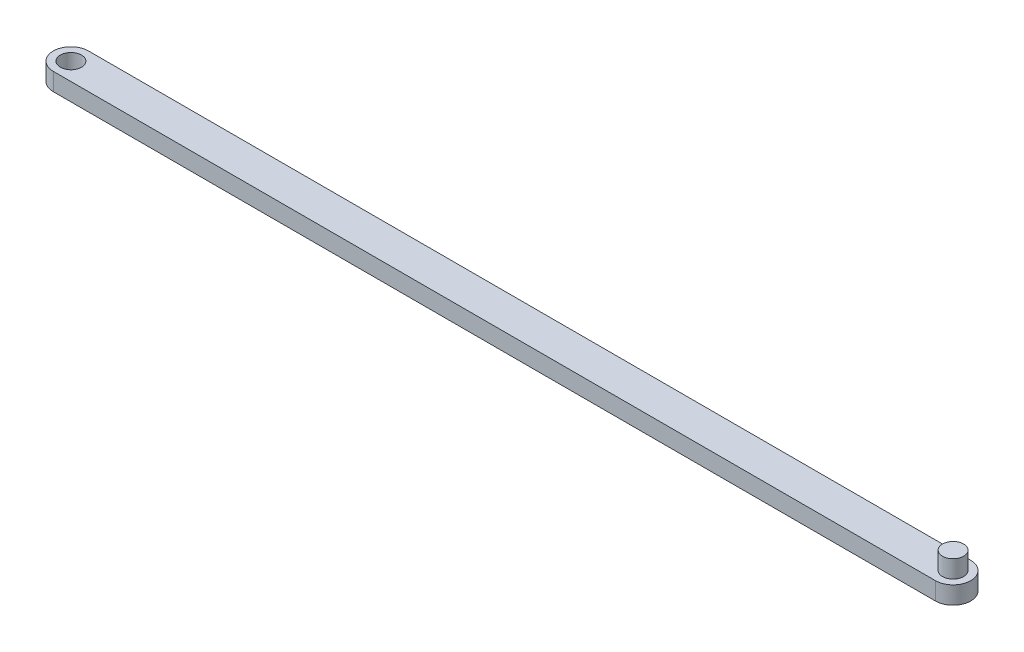
ISO-10303-21;
HEADER;
FILE_DESCRIPTION(('STEP AP214'),'2;1');
FILE_NAME('part.step','',(''),(''),'','','');
FILE_SCHEMA(('AUTOMOTIVE_DESIGN { 1 0 10303 214 1 1 1 1 }'));
ENDSEC;
DATA;
#1=APPLICATION_CONTEXT('core data for automotive mechanical design processes');
#2=APPLICATION_PROTOCOL_DEFINITION('international standard','automotive_design',2000,#1);
#3=PRODUCT_CONTEXT('',#1,'mechanical');
#4=PRODUCT('Part','Part','',(#3));
#5=PRODUCT_RELATED_PRODUCT_CATEGORY('part','',(#4));
#6=PRODUCT_DEFINITION_FORMATION('','',#4);
#7=PRODUCT_DEFINITION_CONTEXT('part definition',#1,'design');
#8=PRODUCT_DEFINITION('design','',#6,#7);
#9=PRODUCT_DEFINITION_SHAPE('','',#8);
#10=(LENGTH_UNIT() NAMED_UNIT(*) SI_UNIT(.MILLI.,.METRE.));
#11=(NAMED_UNIT(*) PLANE_ANGLE_UNIT() SI_UNIT($,.RADIAN.));
#12=(NAMED_UNIT(*) SI_UNIT($,.STERADIAN.) SOLID_ANGLE_UNIT());
#13=UNCERTAINTY_MEASURE_WITH_UNIT(LENGTH_MEASURE(1.E-05),#10,'distance_accuracy_value','');
#14=(GEOMETRIC_REPRESENTATION_CONTEXT(3) GLOBAL_UNCERTAINTY_ASSIGNED_CONTEXT((#13)) GLOBAL_UNIT_ASSIGNED_CONTEXT((#10,
#11,#12)) REPRESENTATION_CONTEXT('',''));
#15=CARTESIAN_POINT('',(0.,0.,0.));
#16=DIRECTION('',(0.,0.,1.));
#17=DIRECTION('',(1.,0.,0.));
#18=AXIS2_PLACEMENT_3D('',#15,#16,#17);
#19=CARTESIAN_POINT('',(-92.1101256054214,5.,-1.21763683539558));
#20=DIRECTION('',(0.,1.,0.));
#21=DIRECTION('',(0.,0.,1.));
#22=AXIS2_PLACEMENT_3D('',#19,#20,#21);
#23=PLANE('',#22);
#24=CARTESIAN_POINT('',(-92.1101256054214,5.,-1.21763683539558));
#25=DIRECTION('',(0.,1.,0.));
#26=DIRECTION('',(0.,0.,1.));
#27=AXIS2_PLACEMENT_3D('',#24,#25,#26);
#28=CIRCLE('',#27,3.00000000000001);
#29=CARTESIAN_POINT('',(-92.1101256054214,5.,1.78236316460443));
#30=VERTEX_POINT('',#29);
#31=EDGE_CURVE('E102',#30,#30,#28,.T.);
#32=ORIENTED_EDGE('',*,*,#31,.F.);
#33=EDGE_LOOP('',(#32));
#34=FACE_BOUND('',#33,.T.);
#35=CARTESIAN_POINT('',(-92.1101256054214,5.,-1.21763683539558));
#36=DIRECTION('',(0.,1.,0.));
#37=DIRECTION('',(0.,0.,1.));
#38=AXIS2_PLACEMENT_3D('',#35,#36,#37);
#39=CIRCLE('',#38,5.);
#40=CARTESIAN_POINT('',(-92.1101256054214,5.,-6.21763683539558));
#41=VERTEX_POINT('',#40);
#42=CARTESIAN_POINT('',(-92.1101256054214,5.,3.78236316460442));
#43=VERTEX_POINT('',#42);
#44=EDGE_CURVE('E87',#41,#43,#39,.T.);
#45=ORIENTED_EDGE('',*,*,#44,.T.);
#46=DIRECTION('',(1.,0.,0.));
#47=VECTOR('',#46,1.);
#48=CARTESIAN_POINT('',(157.889874394579,5.,3.78236316460442));
#49=LINE('',#48,#47);
#50=CARTESIAN_POINT('',(157.889874394579,5.,3.78236316460442));
#51=VERTEX_POINT('',#50);
#52=EDGE_CURVE('E82',#43,#51,#49,.T.);
#53=ORIENTED_EDGE('',*,*,#52,.T.);
#54=CARTESIAN_POINT('',(157.889874394579,5.,-1.21763683539558));
#55=DIRECTION('',(0.,1.,0.));
#56=DIRECTION('',(0.,0.,1.));
#57=AXIS2_PLACEMENT_3D('',#54,#55,#56);
#58=CIRCLE('',#57,5.);
#59=CARTESIAN_POINT('',(157.889874394579,5.,-6.21763683539558));
#60=VERTEX_POINT('',#59);
#61=EDGE_CURVE('E85',#51,#60,#58,.T.);
#62=ORIENTED_EDGE('',*,*,#61,.T.);
#63=DIRECTION('',(-1.,0.,0.));
#64=VECTOR('',#63,1.);
#65=CARTESIAN_POINT('',(-92.1101256054214,5.,-6.21763683539558));
#66=LINE('',#65,#64);
#67=EDGE_CURVE('E52',#60,#41,#66,.T.);
#68=ORIENTED_EDGE('',*,*,#67,.T.);
#69=EDGE_LOOP('',(#45,#53,#62,#68));
#70=FACE_BOUND('',#69,.T.);
#71=CARTESIAN_POINT('',(157.889874394579,5.,-1.21763683539558));
#72=DIRECTION('',(0.,1.,0.));
#73=DIRECTION('',(0.,0.,1.));
#74=AXIS2_PLACEMENT_3D('',#71,#72,#73);
#75=CIRCLE('',#74,3.00000000000002);
#76=CARTESIAN_POINT('',(157.889874394579,5.,1.78236316460444));
#77=VERTEX_POINT('',#76);
#78=EDGE_CURVE('E120',#77,#77,#75,.T.);
#79=ORIENTED_EDGE('',*,*,#78,.F.);
#80=EDGE_LOOP('',(#79));
#81=FACE_BOUND('',#80,.T.);
#82=ADVANCED_FACE('F35',(#34,#70,#81),#23,.T.);
#83=CARTESIAN_POINT('',(-92.1101256054214,0.,-1.21763683539558));
#84=DIRECTION('',(0.,1.,0.));
#85=DIRECTION('',(0.,0.,1.));
#86=AXIS2_PLACEMENT_3D('',#83,#84,#85);
#87=PLANE('',#86);
#88=CARTESIAN_POINT('',(-92.1101256054214,0.,-1.21763683539558));
#89=DIRECTION('',(0.,1.,0.));
#90=DIRECTION('',(0.,0.,1.));
#91=AXIS2_PLACEMENT_3D('',#88,#89,#90);
#92=CIRCLE('',#91,5.);
#93=CARTESIAN_POINT('',(-92.1101256054214,0.,-6.21763683539558));
#94=VERTEX_POINT('',#93);
#95=CARTESIAN_POINT('',(-92.1101256054214,0.,3.78236316460442));
#96=VERTEX_POINT('',#95);
#97=EDGE_CURVE('E99',#94,#96,#92,.T.);
#98=ORIENTED_EDGE('',*,*,#97,.F.);
#99=DIRECTION('',(-1.,0.,0.));
#100=VECTOR('',#99,1.);
#101=CARTESIAN_POINT('',(-92.1101256054214,0.,-6.21763683539558));
#102=LINE('',#101,#100);
#103=CARTESIAN_POINT('',(157.889874394579,0.,-6.21763683539558));
#104=VERTEX_POINT('',#103);
#105=EDGE_CURVE('E75',#104,#94,#102,.T.);
#106=ORIENTED_EDGE('',*,*,#105,.F.);
#107=CARTESIAN_POINT('',(157.889874394579,0.,-1.21763683539558));
#108=DIRECTION('',(0.,1.,0.));
#109=DIRECTION('',(0.,0.,1.));
#110=AXIS2_PLACEMENT_3D('',#107,#108,#109);
#111=CIRCLE('',#110,5.);
#112=CARTESIAN_POINT('',(157.889874394579,0.,3.78236316460442));
#113=VERTEX_POINT('',#112);
#114=EDGE_CURVE('E69',#113,#104,#111,.T.);
#115=ORIENTED_EDGE('',*,*,#114,.F.);
#116=DIRECTION('',(1.,0.,0.));
#117=VECTOR('',#116,1.);
#118=CARTESIAN_POINT('',(157.889874394579,0.,3.78236316460442));
#119=LINE('',#118,#117);
#120=EDGE_CURVE('E91',#96,#113,#119,.T.);
#121=ORIENTED_EDGE('',*,*,#120,.F.);
#122=EDGE_LOOP('',(#98,#106,#115,#121));
#123=FACE_BOUND('',#122,.T.);
#124=CARTESIAN_POINT('',(-92.1101256054214,0.,-1.21763683539558));
#125=DIRECTION('',(0.,1.,0.));
#126=DIRECTION('',(0.,0.,1.));
#127=AXIS2_PLACEMENT_3D('',#124,#125,#126);
#128=CIRCLE('',#127,3.00000000000001);
#129=CARTESIAN_POINT('',(-92.1101256054214,0.,1.78236316460443));
#130=VERTEX_POINT('',#129);
#131=EDGE_CURVE('E114',#130,#130,#128,.T.);
#132=ORIENTED_EDGE('',*,*,#131,.T.);
#133=EDGE_LOOP('',(#132));
#134=FACE_BOUND('',#133,.T.);
#135=ADVANCED_FACE('F110',(#123,#134),#87,.F.);
#136=CARTESIAN_POINT('',(-92.1101256054214,5.,-1.21763683539558));
#137=DIRECTION('',(0.,-1.,0.));
#138=DIRECTION('',(0.,0.,-1.));
#139=AXIS2_PLACEMENT_3D('',#136,#137,#138);
#140=CYLINDRICAL_SURFACE('',#139,5.);
#141=ORIENTED_EDGE('',*,*,#97,.T.);
#142=DIRECTION('',(0.,-1.,0.));
#143=VECTOR('',#142,1.);
#144=CARTESIAN_POINT('',(-92.1101256054214,5.,3.78236316460442));
#145=LINE('',#144,#143);
#146=EDGE_CURVE('E11',#43,#96,#145,.T.);
#147=ORIENTED_EDGE('',*,*,#146,.F.);
#148=ORIENTED_EDGE('',*,*,#44,.F.);
#149=DIRECTION('',(0.,-1.,0.));
#150=VECTOR('',#149,1.);
#151=CARTESIAN_POINT('',(-92.1101256054214,5.,-6.21763683539558));
#152=LINE('',#151,#150);
#153=EDGE_CURVE('E95',#41,#94,#152,.T.);
#154=ORIENTED_EDGE('',*,*,#153,.T.);
#155=EDGE_LOOP('',(#141,#147,#148,#154));
#156=FACE_BOUND('',#155,.T.);
#157=ADVANCED_FACE('F37',(#156),#140,.T.);
#158=CARTESIAN_POINT('',(157.889874394579,5.,3.78236316460442));
#159=DIRECTION('',(0.,0.,-1.));
#160=DIRECTION('',(-1.,0.,0.));
#161=AXIS2_PLACEMENT_3D('',#158,#159,#160);
#162=PLANE('',#161);
#163=ORIENTED_EDGE('',*,*,#120,.T.);
#164=DIRECTION('',(0.,-1.,0.));
#165=VECTOR('',#164,1.);
#166=CARTESIAN_POINT('',(157.889874394579,5.,3.78236316460442));
#167=LINE('',#166,#165);
#168=EDGE_CURVE('E44',#51,#113,#167,.T.);
#169=ORIENTED_EDGE('',*,*,#168,.F.);
#170=ORIENTED_EDGE('',*,*,#52,.F.);
#171=ORIENTED_EDGE('',*,*,#146,.T.);
#172=EDGE_LOOP('',(#163,#169,#170,#171));
#173=FACE_BOUND('',#172,.T.);
#174=ADVANCED_FACE('F90',(#173),#162,.F.);
#175=CARTESIAN_POINT('',(157.889874394579,5.,-1.21763683539558));
#176=DIRECTION('',(0.,-1.,0.));
#177=DIRECTION('',(0.,0.,-1.));
#178=AXIS2_PLACEMENT_3D('',#175,#176,#177);
#179=CYLINDRICAL_SURFACE('',#178,5.);
#180=ORIENTED_EDGE('',*,*,#114,.T.);
#181=DIRECTION('',(0.,-1.,0.));
#182=VECTOR('',#181,1.);
#183=CARTESIAN_POINT('',(157.889874394579,5.,-6.21763683539558));
#184=LINE('',#183,#182);
#185=EDGE_CURVE('E92',#60,#104,#184,.T.);
#186=ORIENTED_EDGE('',*,*,#185,.F.);
#187=ORIENTED_EDGE('',*,*,#61,.F.);
#188=ORIENTED_EDGE('',*,*,#168,.T.);
#189=EDGE_LOOP('',(#180,#186,#187,#188));
#190=FACE_BOUND('',#189,.T.);
#191=ADVANCED_FACE('F93',(#190),#179,.T.);
#192=CARTESIAN_POINT('',(-92.1101256054214,5.,-6.21763683539558));
#193=DIRECTION('',(0.,0.,1.));
#194=DIRECTION('',(1.,0.,0.));
#195=AXIS2_PLACEMENT_3D('',#192,#193,#194);
#196=PLANE('',#195);
#197=ORIENTED_EDGE('',*,*,#105,.T.);
#198=ORIENTED_EDGE('',*,*,#153,.F.);
#199=ORIENTED_EDGE('',*,*,#67,.F.);
#200=ORIENTED_EDGE('',*,*,#185,.T.);
#201=EDGE_LOOP('',(#197,#198,#199,#200));
#202=FACE_BOUND('',#201,.T.);
#203=ADVANCED_FACE('F107',(#202),#196,.F.);
#204=CARTESIAN_POINT('',(-92.1101256054214,5.,-1.21763683539558));
#205=DIRECTION('',(0.,-1.,0.));
#206=DIRECTION('',(0.,0.,-1.));
#207=AXIS2_PLACEMENT_3D('',#204,#205,#206);
#208=CYLINDRICAL_SURFACE('',#207,3.00000000000001);
#209=ORIENTED_EDGE('',*,*,#31,.T.);
#210=EDGE_LOOP('',(#209));
#211=FACE_BOUND('',#210,.T.);
#212=ORIENTED_EDGE('',*,*,#131,.F.);
#213=EDGE_LOOP('',(#212));
#214=FACE_BOUND('',#213,.T.);
#215=ADVANCED_FACE('F131',(#211,#214),#208,.F.);
#216=CARTESIAN_POINT('',(157.889874394579,10.,-1.21763683539558));
#217=DIRECTION('',(0.,-1.,0.));
#218=DIRECTION('',(0.,0.,-1.));
#219=AXIS2_PLACEMENT_3D('',#216,#217,#218);
#220=CYLINDRICAL_SURFACE('',#219,3.00000000000002);
#221=CARTESIAN_POINT('',(157.889874394579,10.,-1.21763683539558));
#222=DIRECTION('',(0.,1.,0.));
#223=DIRECTION('',(0.,0.,1.));
#224=AXIS2_PLACEMENT_3D('',#221,#222,#223);
#225=CIRCLE('',#224,3.00000000000002);
#226=CARTESIAN_POINT('',(157.889874394579,10.,1.78236316460444));
#227=VERTEX_POINT('',#226);
#228=EDGE_CURVE('E117',#227,#227,#225,.T.);
#229=ORIENTED_EDGE('',*,*,#228,.F.);
#230=EDGE_LOOP('',(#229));
#231=FACE_BOUND('',#230,.T.);
#232=ORIENTED_EDGE('',*,*,#78,.T.);
#233=EDGE_LOOP('',(#232));
#234=FACE_BOUND('',#233,.T.);
#235=ADVANCED_FACE('F128',(#231,#234),#220,.T.);
#236=CARTESIAN_POINT('',(157.889874394579,10.,-1.21763683539558));
#237=DIRECTION('',(0.,1.,0.));
#238=DIRECTION('',(0.,0.,1.));
#239=AXIS2_PLACEMENT_3D('',#236,#237,#238);
#240=PLANE('',#239);
#241=ORIENTED_EDGE('',*,*,#228,.T.);
#242=EDGE_LOOP('',(#241));
#243=FACE_BOUND('',#242,.T.);
#244=ADVANCED_FACE('F126',(#243),#240,.T.);
#245=CLOSED_SHELL('',(#82,#135,#157,#174,#191,#203,#215,#235,#244));
#246=MANIFOLD_SOLID_BREP('B2',#245);
#247=ADVANCED_BREP_SHAPE_REPRESENTATION('',(#18,#246),#14);
#248=SHAPE_DEFINITION_REPRESENTATION(#9,#247);
ENDSEC;
END-ISO-10303-21;
